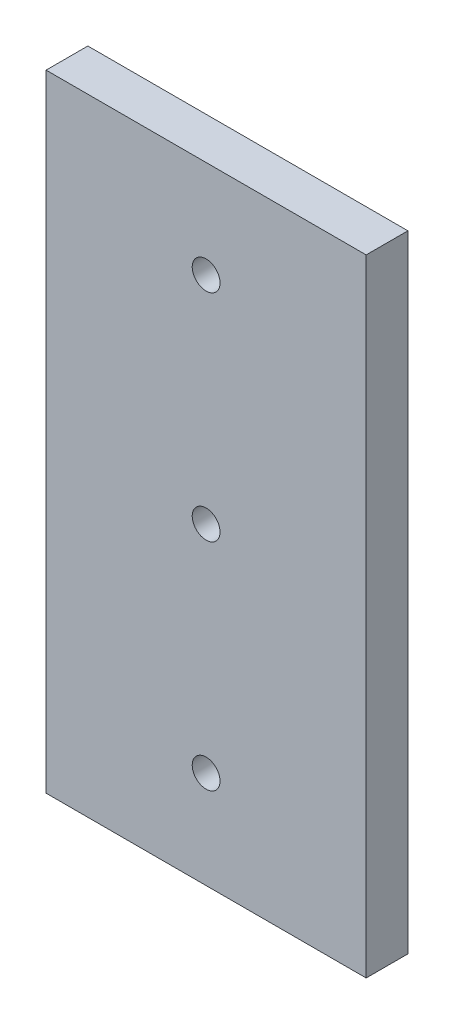
ISO-10303-21;
HEADER;
FILE_DESCRIPTION(('STEP AP214'),'2;1');
FILE_NAME('part.step','',(''),(''),'','','');
FILE_SCHEMA(('AUTOMOTIVE_DESIGN { 1 0 10303 214 1 1 1 1 }'));
ENDSEC;
DATA;
#1=APPLICATION_CONTEXT('core data for automotive mechanical design processes');
#2=APPLICATION_PROTOCOL_DEFINITION('international standard','automotive_design',2000,#1);
#3=PRODUCT_CONTEXT('',#1,'mechanical');
#4=PRODUCT('Part','Part','',(#3));
#5=PRODUCT_RELATED_PRODUCT_CATEGORY('part','',(#4));
#6=PRODUCT_DEFINITION_FORMATION('','',#4);
#7=PRODUCT_DEFINITION_CONTEXT('part definition',#1,'design');
#8=PRODUCT_DEFINITION('design','',#6,#7);
#9=PRODUCT_DEFINITION_SHAPE('','',#8);
#10=(LENGTH_UNIT() NAMED_UNIT(*) SI_UNIT(.MILLI.,.METRE.));
#11=(NAMED_UNIT(*) PLANE_ANGLE_UNIT() SI_UNIT($,.RADIAN.));
#12=(NAMED_UNIT(*) SI_UNIT($,.STERADIAN.) SOLID_ANGLE_UNIT());
#13=UNCERTAINTY_MEASURE_WITH_UNIT(LENGTH_MEASURE(1.E-05),#10,'distance_accuracy_value','');
#14=(GEOMETRIC_REPRESENTATION_CONTEXT(3) GLOBAL_UNCERTAINTY_ASSIGNED_CONTEXT((#13)) GLOBAL_UNIT_ASSIGNED_CONTEXT((#10,
#11,#12)) REPRESENTATION_CONTEXT('',''));
#15=CARTESIAN_POINT('',(0.,0.,0.));
#16=DIRECTION('',(0.,0.,1.));
#17=DIRECTION('',(1.,0.,0.));
#18=AXIS2_PLACEMENT_3D('',#15,#16,#17);
#19=CARTESIAN_POINT('',(0.,0.,15.));
#20=DIRECTION('',(1.,0.,0.));
#21=DIRECTION('',(0.,1.,0.));
#22=AXIS2_PLACEMENT_3D('',#19,#20,#21);
#23=PLANE('',#22);
#24=DIRECTION('',(0.,-1.,0.));
#25=VECTOR('',#24,1.);
#26=CARTESIAN_POINT('',(0.,0.,0.));
#27=LINE('',#26,#25);
#28=CARTESIAN_POINT('',(0.,225.,0.));
#29=VERTEX_POINT('',#28);
#30=CARTESIAN_POINT('',(0.,0.,0.));
#31=VERTEX_POINT('',#30);
#32=EDGE_CURVE('E99',#29,#31,#27,.T.);
#33=ORIENTED_EDGE('',*,*,#32,.T.);
#34=DIRECTION('',(0.,0.,-1.));
#35=VECTOR('',#34,1.);
#36=CARTESIAN_POINT('',(0.,0.,15.));
#37=LINE('',#36,#35);
#38=CARTESIAN_POINT('',(0.,0.,15.));
#39=VERTEX_POINT('',#38);
#40=EDGE_CURVE('E11',#39,#31,#37,.T.);
#41=ORIENTED_EDGE('',*,*,#40,.F.);
#42=DIRECTION('',(0.,-1.,0.));
#43=VECTOR('',#42,1.);
#44=CARTESIAN_POINT('',(0.,0.,15.));
#45=LINE('',#44,#43);
#46=CARTESIAN_POINT('',(0.,225.,15.));
#47=VERTEX_POINT('',#46);
#48=EDGE_CURVE('E87',#47,#39,#45,.T.);
#49=ORIENTED_EDGE('',*,*,#48,.F.);
#50=DIRECTION('',(0.,0.,-1.));
#51=VECTOR('',#50,1.);
#52=CARTESIAN_POINT('',(0.,225.,15.));
#53=LINE('',#52,#51);
#54=EDGE_CURVE('E95',#47,#29,#53,.T.);
#55=ORIENTED_EDGE('',*,*,#54,.T.);
#56=EDGE_LOOP('',(#33,#41,#49,#55));
#57=FACE_BOUND('',#56,.T.);
#58=ADVANCED_FACE('F36',(#57),#23,.F.);
#59=CARTESIAN_POINT('',(0.,0.,15.));
#60=DIRECTION('',(0.,1.,0.));
#61=DIRECTION('',(0.,0.,1.));
#62=AXIS2_PLACEMENT_3D('',#59,#60,#61);
#63=PLANE('',#62);
#64=DIRECTION('',(1.,0.,0.));
#65=VECTOR('',#64,1.);
#66=CARTESIAN_POINT('',(0.,0.,0.));
#67=LINE('',#66,#65);
#68=CARTESIAN_POINT('',(115.,0.,0.));
#69=VERTEX_POINT('',#68);
#70=EDGE_CURVE('E91',#31,#69,#67,.T.);
#71=ORIENTED_EDGE('',*,*,#70,.T.);
#72=DIRECTION('',(0.,0.,-1.));
#73=VECTOR('',#72,1.);
#74=CARTESIAN_POINT('',(115.,0.,15.));
#75=LINE('',#74,#73);
#76=CARTESIAN_POINT('',(115.,0.,15.));
#77=VERTEX_POINT('',#76);
#78=EDGE_CURVE('E44',#77,#69,#75,.T.);
#79=ORIENTED_EDGE('',*,*,#78,.F.);
#80=DIRECTION('',(1.,0.,0.));
#81=VECTOR('',#80,1.);
#82=CARTESIAN_POINT('',(0.,0.,15.));
#83=LINE('',#82,#81);
#84=EDGE_CURVE('E82',#39,#77,#83,.T.);
#85=ORIENTED_EDGE('',*,*,#84,.F.);
#86=ORIENTED_EDGE('',*,*,#40,.T.);
#87=EDGE_LOOP('',(#71,#79,#85,#86));
#88=FACE_BOUND('',#87,.T.);
#89=ADVANCED_FACE('F90',(#88),#63,.F.);
#90=CARTESIAN_POINT('',(115.,0.,15.));
#91=DIRECTION('',(-1.,0.,0.));
#92=DIRECTION('',(0.,-1.,0.));
#93=AXIS2_PLACEMENT_3D('',#90,#91,#92);
#94=PLANE('',#93);
#95=DIRECTION('',(0.,1.,0.));
#96=VECTOR('',#95,1.);
#97=CARTESIAN_POINT('',(115.,0.,0.));
#98=LINE('',#97,#96);
#99=CARTESIAN_POINT('',(115.,225.,0.));
#100=VERTEX_POINT('',#99);
#101=EDGE_CURVE('E69',#69,#100,#98,.T.);
#102=ORIENTED_EDGE('',*,*,#101,.T.);
#103=DIRECTION('',(0.,0.,-1.));
#104=VECTOR('',#103,1.);
#105=CARTESIAN_POINT('',(115.,225.,15.));
#106=LINE('',#105,#104);
#107=CARTESIAN_POINT('',(115.,225.,15.));
#108=VERTEX_POINT('',#107);
#109=EDGE_CURVE('E92',#108,#100,#106,.T.);
#110=ORIENTED_EDGE('',*,*,#109,.F.);
#111=DIRECTION('',(0.,1.,0.));
#112=VECTOR('',#111,1.);
#113=CARTESIAN_POINT('',(115.,0.,15.));
#114=LINE('',#113,#112);
#115=EDGE_CURVE('E85',#77,#108,#114,.T.);
#116=ORIENTED_EDGE('',*,*,#115,.F.);
#117=ORIENTED_EDGE('',*,*,#78,.T.);
#118=EDGE_LOOP('',(#102,#110,#116,#117));
#119=FACE_BOUND('',#118,.T.);
#120=ADVANCED_FACE('F93',(#119),#94,.F.);
#121=CARTESIAN_POINT('',(0.,225.,15.));
#122=DIRECTION('',(0.,-1.,0.));
#123=DIRECTION('',(0.,0.,-1.));
#124=AXIS2_PLACEMENT_3D('',#121,#122,#123);
#125=PLANE('',#124);
#126=DIRECTION('',(-1.,0.,0.));
#127=VECTOR('',#126,1.);
#128=CARTESIAN_POINT('',(0.,225.,0.));
#129=LINE('',#128,#127);
#130=EDGE_CURVE('E75',#100,#29,#129,.T.);
#131=ORIENTED_EDGE('',*,*,#130,.T.);
#132=ORIENTED_EDGE('',*,*,#54,.F.);
#133=DIRECTION('',(-1.,0.,0.));
#134=VECTOR('',#133,1.);
#135=CARTESIAN_POINT('',(0.,225.,15.));
#136=LINE('',#135,#134);
#137=EDGE_CURVE('E52',#108,#47,#136,.T.);
#138=ORIENTED_EDGE('',*,*,#137,.F.);
#139=ORIENTED_EDGE('',*,*,#109,.T.);
#140=EDGE_LOOP('',(#131,#132,#138,#139));
#141=FACE_BOUND('',#140,.T.);
#142=ADVANCED_FACE('F107',(#141),#125,.F.);
#143=CARTESIAN_POINT('',(0.,0.,15.));
#144=DIRECTION('',(0.,0.,-1.));
#145=DIRECTION('',(-1.,0.,0.));
#146=AXIS2_PLACEMENT_3D('',#143,#144,#145);
#147=PLANE('',#146);
#148=CARTESIAN_POINT('',(57.5,35.0000000000001,15.));
#149=DIRECTION('',(0.,0.,1.));
#150=DIRECTION('',(-1.,0.,0.));
#151=AXIS2_PLACEMENT_3D('',#148,#149,#150);
#152=CIRCLE('',#151,5.);
#153=CARTESIAN_POINT('',(52.5,35.0000000000001,15.));
#154=VERTEX_POINT('',#153);
#155=EDGE_CURVE('E125',#154,#154,#152,.T.);
#156=ORIENTED_EDGE('',*,*,#155,.F.);
#157=EDGE_LOOP('',(#156));
#158=FACE_BOUND('',#157,.T.);
#159=CARTESIAN_POINT('',(57.5,112.5,15.));
#160=DIRECTION('',(0.,0.,1.));
#161=DIRECTION('',(1.,0.,0.));
#162=AXIS2_PLACEMENT_3D('',#159,#160,#161);
#163=CIRCLE('',#162,5.);
#164=CARTESIAN_POINT('',(62.5,112.5,15.));
#165=VERTEX_POINT('',#164);
#166=EDGE_CURVE('E119',#165,#165,#163,.T.);
#167=ORIENTED_EDGE('',*,*,#166,.F.);
#168=EDGE_LOOP('',(#167));
#169=FACE_BOUND('',#168,.T.);
#170=CARTESIAN_POINT('',(57.5,190.,15.));
#171=DIRECTION('',(0.,0.,1.));
#172=DIRECTION('',(1.,0.,0.));
#173=AXIS2_PLACEMENT_3D('',#170,#171,#172);
#174=CIRCLE('',#173,5.);
#175=CARTESIAN_POINT('',(62.5,190.,15.));
#176=VERTEX_POINT('',#175);
#177=EDGE_CURVE('E113',#176,#176,#174,.T.);
#178=ORIENTED_EDGE('',*,*,#177,.F.);
#179=EDGE_LOOP('',(#178));
#180=FACE_BOUND('',#179,.T.);
#181=ORIENTED_EDGE('',*,*,#48,.T.);
#182=ORIENTED_EDGE('',*,*,#84,.T.);
#183=ORIENTED_EDGE('',*,*,#115,.T.);
#184=ORIENTED_EDGE('',*,*,#137,.T.);
#185=EDGE_LOOP('',(#181,#182,#183,#184));
#186=FACE_BOUND('',#185,.T.);
#187=ADVANCED_FACE('F83',(#158,#169,#180,#186),#147,.F.);
#188=CARTESIAN_POINT('',(0.,0.,0.));
#189=DIRECTION('',(0.,0.,-1.));
#190=DIRECTION('',(-1.,0.,0.));
#191=AXIS2_PLACEMENT_3D('',#188,#189,#190);
#192=PLANE('',#191);
#193=CARTESIAN_POINT('',(57.5,35.0000000000001,0.));
#194=DIRECTION('',(0.,0.,1.));
#195=DIRECTION('',(-1.,0.,0.));
#196=AXIS2_PLACEMENT_3D('',#193,#194,#195);
#197=CIRCLE('',#196,5.);
#198=CARTESIAN_POINT('',(52.5,35.0000000000001,0.));
#199=VERTEX_POINT('',#198);
#200=EDGE_CURVE('E122',#199,#199,#197,.T.);
#201=ORIENTED_EDGE('',*,*,#200,.T.);
#202=EDGE_LOOP('',(#201));
#203=FACE_BOUND('',#202,.T.);
#204=CARTESIAN_POINT('',(57.5,112.5,0.));
#205=DIRECTION('',(0.,0.,1.));
#206=DIRECTION('',(1.,0.,0.));
#207=AXIS2_PLACEMENT_3D('',#204,#205,#206);
#208=CIRCLE('',#207,5.);
#209=CARTESIAN_POINT('',(62.5,112.5,0.));
#210=VERTEX_POINT('',#209);
#211=EDGE_CURVE('E116',#210,#210,#208,.T.);
#212=ORIENTED_EDGE('',*,*,#211,.T.);
#213=EDGE_LOOP('',(#212));
#214=FACE_BOUND('',#213,.T.);
#215=CARTESIAN_POINT('',(57.5,190.,0.));
#216=DIRECTION('',(0.,0.,1.));
#217=DIRECTION('',(1.,0.,0.));
#218=AXIS2_PLACEMENT_3D('',#215,#216,#217);
#219=CIRCLE('',#218,5.);
#220=CARTESIAN_POINT('',(62.5,190.,0.));
#221=VERTEX_POINT('',#220);
#222=EDGE_CURVE('E102',#221,#221,#219,.T.);
#223=ORIENTED_EDGE('',*,*,#222,.T.);
#224=EDGE_LOOP('',(#223));
#225=FACE_BOUND('',#224,.T.);
#226=ORIENTED_EDGE('',*,*,#32,.F.);
#227=ORIENTED_EDGE('',*,*,#130,.F.);
#228=ORIENTED_EDGE('',*,*,#101,.F.);
#229=ORIENTED_EDGE('',*,*,#70,.F.);
#230=EDGE_LOOP('',(#226,#227,#228,#229));
#231=FACE_BOUND('',#230,.T.);
#232=ADVANCED_FACE('F110',(#203,#214,#225,#231),#192,.T.);
#233=CARTESIAN_POINT('',(57.5,190.,0.));
#234=DIRECTION('',(0.,0.,1.));
#235=DIRECTION('',(1.,0.,0.));
#236=AXIS2_PLACEMENT_3D('',#233,#234,#235);
#237=CYLINDRICAL_SURFACE('',#236,5.);
#238=ORIENTED_EDGE('',*,*,#222,.F.);
#239=EDGE_LOOP('',(#238));
#240=FACE_BOUND('',#239,.T.);
#241=ORIENTED_EDGE('',*,*,#177,.T.);
#242=EDGE_LOOP('',(#241));
#243=FACE_BOUND('',#242,.T.);
#244=ADVANCED_FACE('F147',(#240,#243),#237,.F.);
#245=CARTESIAN_POINT('',(57.5,112.5,0.));
#246=DIRECTION('',(0.,0.,1.));
#247=DIRECTION('',(1.,0.,0.));
#248=AXIS2_PLACEMENT_3D('',#245,#246,#247);
#249=CYLINDRICAL_SURFACE('',#248,5.);
#250=ORIENTED_EDGE('',*,*,#211,.F.);
#251=EDGE_LOOP('',(#250));
#252=FACE_BOUND('',#251,.T.);
#253=ORIENTED_EDGE('',*,*,#166,.T.);
#254=EDGE_LOOP('',(#253));
#255=FACE_BOUND('',#254,.T.);
#256=ADVANCED_FACE('F136',(#252,#255),#249,.F.);
#257=CARTESIAN_POINT('',(57.5,35.0000000000001,0.));
#258=DIRECTION('',(0.,0.,1.));
#259=DIRECTION('',(1.,0.,0.));
#260=AXIS2_PLACEMENT_3D('',#257,#258,#259);
#261=CYLINDRICAL_SURFACE('',#260,5.);
#262=ORIENTED_EDGE('',*,*,#200,.F.);
#263=EDGE_LOOP('',(#262));
#264=FACE_BOUND('',#263,.T.);
#265=ORIENTED_EDGE('',*,*,#155,.T.);
#266=EDGE_LOOP('',(#265));
#267=FACE_BOUND('',#266,.T.);
#268=ADVANCED_FACE('F133',(#264,#267),#261,.F.);
#269=CLOSED_SHELL('',(#58,#89,#120,#142,#187,#232,#244,#256,#268));
#270=MANIFOLD_SOLID_BREP('B2',#269);
#271=ADVANCED_BREP_SHAPE_REPRESENTATION('',(#18,#270),#14);
#272=SHAPE_DEFINITION_REPRESENTATION(#9,#271);
ENDSEC;
END-ISO-10303-21;
